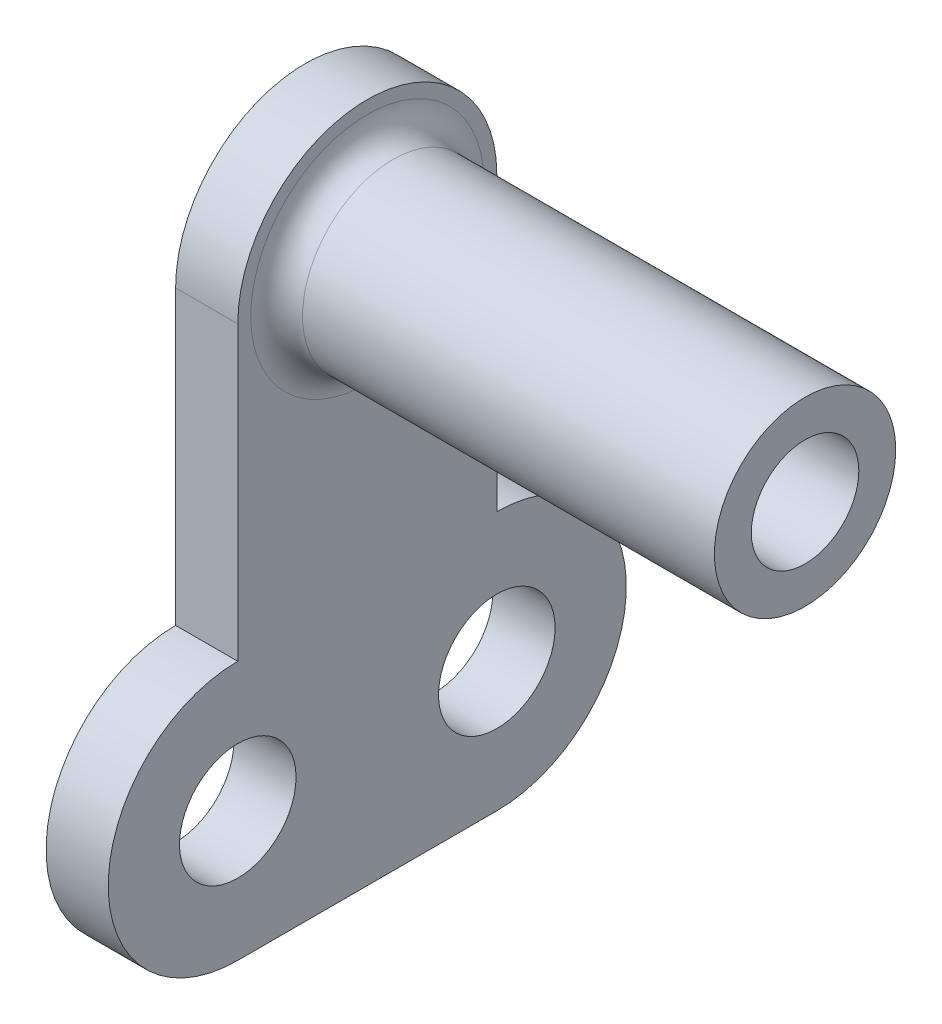
ISO-10303-21;
HEADER;
FILE_DESCRIPTION(('STEP AP214'),'2;1');
FILE_NAME('part.step','',(''),(''),'','','');
FILE_SCHEMA(('AUTOMOTIVE_DESIGN { 1 0 10303 214 1 1 1 1 }'));
ENDSEC;
DATA;
#1=APPLICATION_CONTEXT('core data for automotive mechanical design processes');
#2=APPLICATION_PROTOCOL_DEFINITION('international standard','automotive_design',2000,#1);
#3=PRODUCT_CONTEXT('',#1,'mechanical');
#4=PRODUCT('Part','Part','',(#3));
#5=PRODUCT_RELATED_PRODUCT_CATEGORY('part','',(#4));
#6=PRODUCT_DEFINITION_FORMATION('','',#4);
#7=PRODUCT_DEFINITION_CONTEXT('part definition',#1,'design');
#8=PRODUCT_DEFINITION('design','',#6,#7);
#9=PRODUCT_DEFINITION_SHAPE('','',#8);
#10=(LENGTH_UNIT() NAMED_UNIT(*) SI_UNIT(.MILLI.,.METRE.));
#11=(NAMED_UNIT(*) PLANE_ANGLE_UNIT() SI_UNIT($,.RADIAN.));
#12=(NAMED_UNIT(*) SI_UNIT($,.STERADIAN.) SOLID_ANGLE_UNIT());
#13=UNCERTAINTY_MEASURE_WITH_UNIT(LENGTH_MEASURE(1.E-05),#10,'distance_accuracy_value','');
#14=(GEOMETRIC_REPRESENTATION_CONTEXT(3) GLOBAL_UNCERTAINTY_ASSIGNED_CONTEXT((#13)) GLOBAL_UNIT_ASSIGNED_CONTEXT((#10,
#11,#12)) REPRESENTATION_CONTEXT('',''));
#15=CARTESIAN_POINT('',(0.,0.,0.));
#16=DIRECTION('',(0.,0.,1.));
#17=DIRECTION('',(1.,0.,0.));
#18=AXIS2_PLACEMENT_3D('',#15,#16,#17);
#19=CARTESIAN_POINT('',(2.4,21.2821563056051,0.));
#20=DIRECTION('',(-1.,0.,0.));
#21=DIRECTION('',(0.,0.,1.));
#22=AXIS2_PLACEMENT_3D('',#19,#20,#21);
#23=CYLINDRICAL_SURFACE('',#22,2.075);
#24=CARTESIAN_POINT('',(19.3,21.2821563056051,0.));
#25=DIRECTION('',(1.,0.,0.));
#26=DIRECTION('',(0.,0.,-1.));
#27=AXIS2_PLACEMENT_3D('',#24,#25,#26);
#28=CIRCLE('',#27,2.075);
#29=CARTESIAN_POINT('',(19.3,21.2821563056051,-2.075));
#30=VERTEX_POINT('',#29);
#31=EDGE_CURVE('E224',#30,#30,#28,.T.);
#32=ORIENTED_EDGE('',*,*,#31,.T.);
#33=EDGE_LOOP('',(#32));
#34=FACE_BOUND('',#33,.T.);
#35=CARTESIAN_POINT('',(4.,21.2821563056051,0.));
#36=DIRECTION('',(-1.,0.,0.));
#37=DIRECTION('',(0.,0.,1.));
#38=AXIS2_PLACEMENT_3D('',#35,#36,#37);
#39=CIRCLE('',#38,2.075);
#40=CARTESIAN_POINT('',(4.,21.2821563056051,2.075));
#41=VERTEX_POINT('',#40);
#42=EDGE_CURVE('E228',#41,#41,#39,.T.);
#43=ORIENTED_EDGE('',*,*,#42,.T.);
#44=EDGE_LOOP('',(#43));
#45=FACE_BOUND('',#44,.T.);
#46=ADVANCED_FACE('F41',(#34,#45),#23,.F.);
#47=CARTESIAN_POINT('',(2.4,5.,5.));
#48=DIRECTION('',(1.,0.,0.));
#49=DIRECTION('',(0.,0.,-1.));
#50=AXIS2_PLACEMENT_3D('',#47,#48,#49);
#51=PLANE('',#50);
#52=CARTESIAN_POINT('',(2.4,21.2821563056051,0.));
#53=DIRECTION('',(1.,0.,0.));
#54=DIRECTION('',(0.,0.,-1.));
#55=AXIS2_PLACEMENT_3D('',#52,#53,#54);
#56=CIRCLE('',#55,4.5);
#57=CARTESIAN_POINT('',(2.4,21.2821563056051,-4.5));
#58=VERTEX_POINT('',#57);
#59=EDGE_CURVE('E11',#58,#58,#56,.F.);
#60=ORIENTED_EDGE('',*,*,#59,.T.);
#61=EDGE_LOOP('',(#60));
#62=FACE_BOUND('',#61,.T.);
#63=CARTESIAN_POINT('',(2.4,5.,-5.));
#64=DIRECTION('',(1.,0.,0.));
#65=DIRECTION('',(0.,0.,-1.));
#66=AXIS2_PLACEMENT_3D('',#63,#64,#65);
#67=CIRCLE('',#66,2.25);
#68=CARTESIAN_POINT('',(2.4,5.,-7.25));
#69=VERTEX_POINT('',#68);
#70=EDGE_CURVE('E212',#69,#69,#67,.T.);
#71=ORIENTED_EDGE('',*,*,#70,.F.);
#72=EDGE_LOOP('',(#71));
#73=FACE_BOUND('',#72,.T.);
#74=CARTESIAN_POINT('',(2.4,5.,5.));
#75=DIRECTION('',(1.,0.,0.));
#76=DIRECTION('',(0.,0.,-1.));
#77=AXIS2_PLACEMENT_3D('',#74,#75,#76);
#78=CIRCLE('',#77,5.);
#79=CARTESIAN_POINT('',(2.4,10.,5.));
#80=VERTEX_POINT('',#79);
#81=CARTESIAN_POINT('',(2.4,0.,5.));
#82=VERTEX_POINT('',#81);
#83=EDGE_CURVE('E139',#80,#82,#78,.T.);
#84=ORIENTED_EDGE('',*,*,#83,.T.);
#85=DIRECTION('',(0.,0.,-1.));
#86=VECTOR('',#85,1.);
#87=CARTESIAN_POINT('',(2.4,0.,5.));
#88=LINE('',#87,#86);
#89=CARTESIAN_POINT('',(2.4,0.,-5.));
#90=VERTEX_POINT('',#89);
#91=EDGE_CURVE('E98',#82,#90,#88,.T.);
#92=ORIENTED_EDGE('',*,*,#91,.T.);
#93=CARTESIAN_POINT('',(2.4,5.,-5.));
#94=DIRECTION('',(1.,0.,0.));
#95=DIRECTION('',(0.,0.,-1.));
#96=AXIS2_PLACEMENT_3D('',#93,#94,#95);
#97=CIRCLE('',#96,5.);
#98=CARTESIAN_POINT('',(2.4,10.,-5.));
#99=VERTEX_POINT('',#98);
#100=EDGE_CURVE('E109',#90,#99,#97,.T.);
#101=ORIENTED_EDGE('',*,*,#100,.T.);
#102=DIRECTION('',(0.,1.,0.));
#103=VECTOR('',#102,1.);
#104=CARTESIAN_POINT('',(2.4,10.,-5.));
#105=LINE('',#104,#103);
#106=CARTESIAN_POINT('',(2.4,21.2821563056051,-5.));
#107=VERTEX_POINT('',#106);
#108=EDGE_CURVE('E101',#99,#107,#105,.T.);
#109=ORIENTED_EDGE('',*,*,#108,.T.);
#110=CARTESIAN_POINT('',(2.4,21.2821563056051,0.));
#111=DIRECTION('',(1.,0.,0.));
#112=DIRECTION('',(0.,0.,1.));
#113=AXIS2_PLACEMENT_3D('',#110,#111,#112);
#114=CIRCLE('',#113,5.);
#115=CARTESIAN_POINT('',(2.4,21.2821563056051,5.));
#116=VERTEX_POINT('',#115);
#117=EDGE_CURVE('E108',#107,#116,#114,.T.);
#118=ORIENTED_EDGE('',*,*,#117,.T.);
#119=DIRECTION('',(0.,-1.,0.));
#120=VECTOR('',#119,1.);
#121=CARTESIAN_POINT('',(2.4,10.,5.));
#122=LINE('',#121,#120);
#123=EDGE_CURVE('E59',#116,#80,#122,.T.);
#124=ORIENTED_EDGE('',*,*,#123,.T.);
#125=EDGE_LOOP('',(#84,#92,#101,#109,#118,#124));
#126=FACE_BOUND('',#125,.T.);
#127=CARTESIAN_POINT('',(2.4,5.,5.));
#128=DIRECTION('',(1.,0.,0.));
#129=DIRECTION('',(0.,0.,-1.));
#130=AXIS2_PLACEMENT_3D('',#127,#128,#129);
#131=CIRCLE('',#130,2.25);
#132=CARTESIAN_POINT('',(2.4,5.,2.75));
#133=VERTEX_POINT('',#132);
#134=EDGE_CURVE('E132',#133,#133,#131,.T.);
#135=ORIENTED_EDGE('',*,*,#134,.F.);
#136=EDGE_LOOP('',(#135));
#137=FACE_BOUND('',#136,.T.);
#138=ADVANCED_FACE('F102',(#62,#73,#126,#137),#51,.T.);
#139=CARTESIAN_POINT('',(0.,5.,5.));
#140=DIRECTION('',(1.,0.,0.));
#141=DIRECTION('',(0.,0.,-1.));
#142=AXIS2_PLACEMENT_3D('',#139,#140,#141);
#143=PLANE('',#142);
#144=CARTESIAN_POINT('',(0.,5.,5.));
#145=DIRECTION('',(1.,0.,0.));
#146=DIRECTION('',(0.,0.,-1.));
#147=AXIS2_PLACEMENT_3D('',#144,#145,#146);
#148=CIRCLE('',#147,5.);
#149=CARTESIAN_POINT('',(0.,10.,5.));
#150=VERTEX_POINT('',#149);
#151=CARTESIAN_POINT('',(0.,0.,5.));
#152=VERTEX_POINT('',#151);
#153=EDGE_CURVE('E127',#150,#152,#148,.T.);
#154=ORIENTED_EDGE('',*,*,#153,.F.);
#155=DIRECTION('',(0.,-1.,0.));
#156=VECTOR('',#155,1.);
#157=CARTESIAN_POINT('',(0.,10.,5.));
#158=LINE('',#157,#156);
#159=CARTESIAN_POINT('',(0.,21.2821563056051,5.));
#160=VERTEX_POINT('',#159);
#161=EDGE_CURVE('E87',#160,#150,#158,.T.);
#162=ORIENTED_EDGE('',*,*,#161,.F.);
#163=CARTESIAN_POINT('',(0.,21.2821563056051,0.));
#164=DIRECTION('',(1.,0.,0.));
#165=DIRECTION('',(0.,0.,1.));
#166=AXIS2_PLACEMENT_3D('',#163,#164,#165);
#167=CIRCLE('',#166,5.);
#168=CARTESIAN_POINT('',(0.,21.2821563056051,-5.));
#169=VERTEX_POINT('',#168);
#170=EDGE_CURVE('E83',#169,#160,#167,.T.);
#171=ORIENTED_EDGE('',*,*,#170,.F.);
#172=DIRECTION('',(0.,1.,0.));
#173=VECTOR('',#172,1.);
#174=CARTESIAN_POINT('',(0.,10.,-5.));
#175=LINE('',#174,#173);
#176=CARTESIAN_POINT('',(0.,10.,-5.));
#177=VERTEX_POINT('',#176);
#178=EDGE_CURVE('E117',#177,#169,#175,.T.);
#179=ORIENTED_EDGE('',*,*,#178,.F.);
#180=CARTESIAN_POINT('',(0.,5.,-5.));
#181=DIRECTION('',(1.,0.,0.));
#182=DIRECTION('',(0.,0.,-1.));
#183=AXIS2_PLACEMENT_3D('',#180,#181,#182);
#184=CIRCLE('',#183,5.);
#185=CARTESIAN_POINT('',(0.,0.,-5.));
#186=VERTEX_POINT('',#185);
#187=EDGE_CURVE('E133',#186,#177,#184,.T.);
#188=ORIENTED_EDGE('',*,*,#187,.F.);
#189=DIRECTION('',(0.,0.,-1.));
#190=VECTOR('',#189,1.);
#191=CARTESIAN_POINT('',(0.,0.,5.));
#192=LINE('',#191,#190);
#193=EDGE_CURVE('E131',#152,#186,#192,.T.);
#194=ORIENTED_EDGE('',*,*,#193,.F.);
#195=EDGE_LOOP('',(#154,#162,#171,#179,#188,#194));
#196=FACE_BOUND('',#195,.T.);
#197=CARTESIAN_POINT('',(0.,5.,5.));
#198=DIRECTION('',(1.,0.,0.));
#199=DIRECTION('',(0.,0.,-1.));
#200=AXIS2_PLACEMENT_3D('',#197,#198,#199);
#201=CIRCLE('',#200,2.25);
#202=CARTESIAN_POINT('',(0.,5.,2.75));
#203=VERTEX_POINT('',#202);
#204=EDGE_CURVE('E208',#203,#203,#201,.T.);
#205=ORIENTED_EDGE('',*,*,#204,.T.);
#206=EDGE_LOOP('',(#205));
#207=FACE_BOUND('',#206,.T.);
#208=CARTESIAN_POINT('',(0.,5.,-5.));
#209=DIRECTION('',(1.,0.,0.));
#210=DIRECTION('',(0.,0.,-1.));
#211=AXIS2_PLACEMENT_3D('',#208,#209,#210);
#212=CIRCLE('',#211,2.25);
#213=CARTESIAN_POINT('',(0.,5.,-7.25));
#214=VERTEX_POINT('',#213);
#215=EDGE_CURVE('E216',#214,#214,#212,.T.);
#216=ORIENTED_EDGE('',*,*,#215,.T.);
#217=EDGE_LOOP('',(#216));
#218=FACE_BOUND('',#217,.T.);
#219=CARTESIAN_POINT('',(0.,21.2821563056051,0.));
#220=DIRECTION('',(-1.,0.,0.));
#221=DIRECTION('',(0.,0.,1.));
#222=AXIS2_PLACEMENT_3D('',#219,#220,#221);
#223=CIRCLE('',#222,1.2);
#224=CARTESIAN_POINT('',(0.,21.2821563056051,1.2));
#225=VERTEX_POINT('',#224);
#226=EDGE_CURVE('E229',#225,#225,#223,.T.);
#227=ORIENTED_EDGE('',*,*,#226,.F.);
#228=EDGE_LOOP('',(#227));
#229=FACE_BOUND('',#228,.T.);
#230=ADVANCED_FACE('F173',(#196,#207,#218,#229),#143,.F.);
#231=CARTESIAN_POINT('',(2.4,5.,5.));
#232=DIRECTION('',(-1.,0.,0.));
#233=DIRECTION('',(0.,0.,1.));
#234=AXIS2_PLACEMENT_3D('',#231,#232,#233);
#235=CYLINDRICAL_SURFACE('',#234,5.);
#236=ORIENTED_EDGE('',*,*,#153,.T.);
#237=DIRECTION('',(-1.,0.,0.));
#238=VECTOR('',#237,1.);
#239=CARTESIAN_POINT('',(2.4,0.,5.));
#240=LINE('',#239,#238);
#241=EDGE_CURVE('E148',#82,#152,#240,.T.);
#242=ORIENTED_EDGE('',*,*,#241,.F.);
#243=ORIENTED_EDGE('',*,*,#83,.F.);
#244=DIRECTION('',(-1.,0.,0.));
#245=VECTOR('',#244,1.);
#246=CARTESIAN_POINT('',(2.4,10.,5.));
#247=LINE('',#246,#245);
#248=EDGE_CURVE('E121',#80,#150,#247,.T.);
#249=ORIENTED_EDGE('',*,*,#248,.T.);
#250=EDGE_LOOP('',(#236,#242,#243,#249));
#251=FACE_BOUND('',#250,.T.);
#252=ADVANCED_FACE('F182',(#251),#235,.T.);
#253=CARTESIAN_POINT('',(2.4,0.,5.));
#254=DIRECTION('',(0.,1.,0.));
#255=DIRECTION('',(0.,0.,1.));
#256=AXIS2_PLACEMENT_3D('',#253,#254,#255);
#257=PLANE('',#256);
#258=ORIENTED_EDGE('',*,*,#193,.T.);
#259=DIRECTION('',(-1.,0.,0.));
#260=VECTOR('',#259,1.);
#261=CARTESIAN_POINT('',(2.4,0.,-5.));
#262=LINE('',#261,#260);
#263=EDGE_CURVE('E141',#90,#186,#262,.T.);
#264=ORIENTED_EDGE('',*,*,#263,.F.);
#265=ORIENTED_EDGE('',*,*,#91,.F.);
#266=ORIENTED_EDGE('',*,*,#241,.T.);
#267=EDGE_LOOP('',(#258,#264,#265,#266));
#268=FACE_BOUND('',#267,.T.);
#269=ADVANCED_FACE('F191',(#268),#257,.F.);
#270=CARTESIAN_POINT('',(2.4,5.,-5.));
#271=DIRECTION('',(-1.,0.,0.));
#272=DIRECTION('',(0.,0.,1.));
#273=AXIS2_PLACEMENT_3D('',#270,#271,#272);
#274=CYLINDRICAL_SURFACE('',#273,5.);
#275=ORIENTED_EDGE('',*,*,#187,.T.);
#276=DIRECTION('',(-1.,0.,0.));
#277=VECTOR('',#276,1.);
#278=CARTESIAN_POINT('',(2.4,10.,-5.));
#279=LINE('',#278,#277);
#280=EDGE_CURVE('E118',#99,#177,#279,.T.);
#281=ORIENTED_EDGE('',*,*,#280,.F.);
#282=ORIENTED_EDGE('',*,*,#100,.F.);
#283=ORIENTED_EDGE('',*,*,#263,.T.);
#284=EDGE_LOOP('',(#275,#281,#282,#283));
#285=FACE_BOUND('',#284,.T.);
#286=ADVANCED_FACE('F194',(#285),#274,.T.);
#287=CARTESIAN_POINT('',(2.4,10.,-5.));
#288=DIRECTION('',(0.,0.,1.));
#289=DIRECTION('',(0.,-1.,0.));
#290=AXIS2_PLACEMENT_3D('',#287,#288,#289);
#291=PLANE('',#290);
#292=ORIENTED_EDGE('',*,*,#178,.T.);
#293=DIRECTION('',(-1.,0.,0.));
#294=VECTOR('',#293,1.);
#295=CARTESIAN_POINT('',(2.4,21.2821563056051,-5.));
#296=LINE('',#295,#294);
#297=EDGE_CURVE('E114',#107,#169,#296,.T.);
#298=ORIENTED_EDGE('',*,*,#297,.F.);
#299=ORIENTED_EDGE('',*,*,#108,.F.);
#300=ORIENTED_EDGE('',*,*,#280,.T.);
#301=EDGE_LOOP('',(#292,#298,#299,#300));
#302=FACE_BOUND('',#301,.T.);
#303=ADVANCED_FACE('F116',(#302),#291,.F.);
#304=CARTESIAN_POINT('',(2.4,21.2821563056051,0.));
#305=DIRECTION('',(-1.,0.,0.));
#306=DIRECTION('',(0.,0.,1.));
#307=AXIS2_PLACEMENT_3D('',#304,#305,#306);
#308=CYLINDRICAL_SURFACE('',#307,5.);
#309=ORIENTED_EDGE('',*,*,#170,.T.);
#310=DIRECTION('',(-1.,0.,0.));
#311=VECTOR('',#310,1.);
#312=CARTESIAN_POINT('',(2.4,21.2821563056051,5.));
#313=LINE('',#312,#311);
#314=EDGE_CURVE('E119',#116,#160,#313,.T.);
#315=ORIENTED_EDGE('',*,*,#314,.F.);
#316=ORIENTED_EDGE('',*,*,#117,.F.);
#317=ORIENTED_EDGE('',*,*,#297,.T.);
#318=EDGE_LOOP('',(#309,#315,#316,#317));
#319=FACE_BOUND('',#318,.T.);
#320=ADVANCED_FACE('F125',(#319),#308,.T.);
#321=CARTESIAN_POINT('',(2.4,10.,5.));
#322=DIRECTION('',(0.,0.,-1.));
#323=DIRECTION('',(0.,1.,0.));
#324=AXIS2_PLACEMENT_3D('',#321,#322,#323);
#325=PLANE('',#324);
#326=ORIENTED_EDGE('',*,*,#161,.T.);
#327=ORIENTED_EDGE('',*,*,#248,.F.);
#328=ORIENTED_EDGE('',*,*,#123,.F.);
#329=ORIENTED_EDGE('',*,*,#314,.T.);
#330=EDGE_LOOP('',(#326,#327,#328,#329));
#331=FACE_BOUND('',#330,.T.);
#332=ADVANCED_FACE('F184',(#331),#325,.F.);
#333=CARTESIAN_POINT('',(2.4,5.,5.));
#334=DIRECTION('',(-1.,0.,0.));
#335=DIRECTION('',(0.,0.,1.));
#336=AXIS2_PLACEMENT_3D('',#333,#334,#335);
#337=CYLINDRICAL_SURFACE('',#336,2.25);
#338=ORIENTED_EDGE('',*,*,#134,.T.);
#339=EDGE_LOOP('',(#338));
#340=FACE_BOUND('',#339,.T.);
#341=ORIENTED_EDGE('',*,*,#204,.F.);
#342=EDGE_LOOP('',(#341));
#343=FACE_BOUND('',#342,.T.);
#344=ADVANCED_FACE('F177',(#340,#343),#337,.F.);
#345=CARTESIAN_POINT('',(2.4,5.,-5.));
#346=DIRECTION('',(-1.,0.,0.));
#347=DIRECTION('',(0.,0.,1.));
#348=AXIS2_PLACEMENT_3D('',#345,#346,#347);
#349=CYLINDRICAL_SURFACE('',#348,2.25);
#350=ORIENTED_EDGE('',*,*,#70,.T.);
#351=EDGE_LOOP('',(#350));
#352=FACE_BOUND('',#351,.T.);
#353=ORIENTED_EDGE('',*,*,#215,.F.);
#354=EDGE_LOOP('',(#353));
#355=FACE_BOUND('',#354,.T.);
#356=ADVANCED_FACE('F246',(#352,#355),#349,.F.);
#357=CARTESIAN_POINT('',(19.3,21.2821563056051,0.));
#358=DIRECTION('',(1.,0.,0.));
#359=DIRECTION('',(0.,0.,-1.));
#360=AXIS2_PLACEMENT_3D('',#357,#358,#359);
#361=PLANE('',#360);
#362=CARTESIAN_POINT('',(19.3,21.2821563056051,0.));
#363=DIRECTION('',(1.,0.,0.));
#364=DIRECTION('',(0.,0.,-1.));
#365=AXIS2_PLACEMENT_3D('',#362,#363,#364);
#366=CIRCLE('',#365,3.5);
#367=CARTESIAN_POINT('',(19.3,21.2821563056051,-3.5));
#368=VERTEX_POINT('',#367);
#369=EDGE_CURVE('E218',#368,#368,#366,.T.);
#370=ORIENTED_EDGE('',*,*,#369,.T.);
#371=EDGE_LOOP('',(#370));
#372=FACE_BOUND('',#371,.T.);
#373=ORIENTED_EDGE('',*,*,#31,.F.);
#374=EDGE_LOOP('',(#373));
#375=FACE_BOUND('',#374,.T.);
#376=ADVANCED_FACE('F165',(#372,#375),#361,.T.);
#377=CARTESIAN_POINT('',(19.3,21.2821563056051,0.));
#378=DIRECTION('',(-1.,0.,0.));
#379=DIRECTION('',(0.,0.,1.));
#380=AXIS2_PLACEMENT_3D('',#377,#378,#379);
#381=CYLINDRICAL_SURFACE('',#380,3.5);
#382=CARTESIAN_POINT('',(3.4,21.2821563056051,0.));
#383=DIRECTION('',(1.,0.,0.));
#384=DIRECTION('',(0.,0.,-1.));
#385=AXIS2_PLACEMENT_3D('',#382,#383,#384);
#386=CIRCLE('',#385,3.5);
#387=CARTESIAN_POINT('',(3.4,21.2821563056051,-3.5));
#388=VERTEX_POINT('',#387);
#389=EDGE_CURVE('E49',#388,#388,#386,.T.);
#390=ORIENTED_EDGE('',*,*,#389,.T.);
#391=EDGE_LOOP('',(#390));
#392=FACE_BOUND('',#391,.T.);
#393=ORIENTED_EDGE('',*,*,#369,.F.);
#394=EDGE_LOOP('',(#393));
#395=FACE_BOUND('',#394,.T.);
#396=ADVANCED_FACE('F146',(#392,#395),#381,.T.);
#397=CARTESIAN_POINT('',(3.4,21.2821563056051,0.));
#398=DIRECTION('',(1.,0.,0.));
#399=DIRECTION('',(0.,0.,-1.));
#400=AXIS2_PLACEMENT_3D('',#397,#398,#399);
#401=TOROIDAL_SURFACE('',#400,4.5,1.);
#402=ORIENTED_EDGE('',*,*,#59,.F.);
#403=EDGE_LOOP('',(#402));
#404=FACE_BOUND('',#403,.T.);
#405=ORIENTED_EDGE('',*,*,#389,.F.);
#406=EDGE_LOOP('',(#405));
#407=FACE_BOUND('',#406,.T.);
#408=ADVANCED_FACE('F43',(#404,#407),#401,.F.);
#409=CARTESIAN_POINT('',(4.,21.2821563056051,0.));
#410=DIRECTION('',(-1.,0.,0.));
#411=DIRECTION('',(0.,0.,1.));
#412=AXIS2_PLACEMENT_3D('',#409,#410,#411);
#413=PLANE('',#412);
#414=CARTESIAN_POINT('',(4.,21.2821563056051,0.));
#415=DIRECTION('',(-1.,0.,0.));
#416=DIRECTION('',(0.,0.,1.));
#417=AXIS2_PLACEMENT_3D('',#414,#415,#416);
#418=CIRCLE('',#417,1.2);
#419=CARTESIAN_POINT('',(4.,21.2821563056051,1.2));
#420=VERTEX_POINT('',#419);
#421=EDGE_CURVE('E230',#420,#420,#418,.T.);
#422=ORIENTED_EDGE('',*,*,#421,.T.);
#423=EDGE_LOOP('',(#422));
#424=FACE_BOUND('',#423,.T.);
#425=ORIENTED_EDGE('',*,*,#42,.F.);
#426=EDGE_LOOP('',(#425));
#427=FACE_BOUND('',#426,.T.);
#428=ADVANCED_FACE('F153',(#424,#427),#413,.F.);
#429=CARTESIAN_POINT('',(4.,21.2821563056051,0.));
#430=DIRECTION('',(-1.,0.,0.));
#431=DIRECTION('',(0.,0.,1.));
#432=AXIS2_PLACEMENT_3D('',#429,#430,#431);
#433=CYLINDRICAL_SURFACE('',#432,1.2);
#434=ORIENTED_EDGE('',*,*,#421,.F.);
#435=EDGE_LOOP('',(#434));
#436=FACE_BOUND('',#435,.T.);
#437=ORIENTED_EDGE('',*,*,#226,.T.);
#438=EDGE_LOOP('',(#437));
#439=FACE_BOUND('',#438,.T.);
#440=ADVANCED_FACE('F163',(#436,#439),#433,.F.);
#441=CLOSED_SHELL('',(#46,#138,#230,#252,#269,#286,#303,#320,#332,#344,#356,#376,#396,#408,#428,#440));
#442=MANIFOLD_SOLID_BREP('B2',#441);
#443=ADVANCED_BREP_SHAPE_REPRESENTATION('',(#18,#442),#14);
#444=SHAPE_DEFINITION_REPRESENTATION(#9,#443);
ENDSEC;
END-ISO-10303-21;
